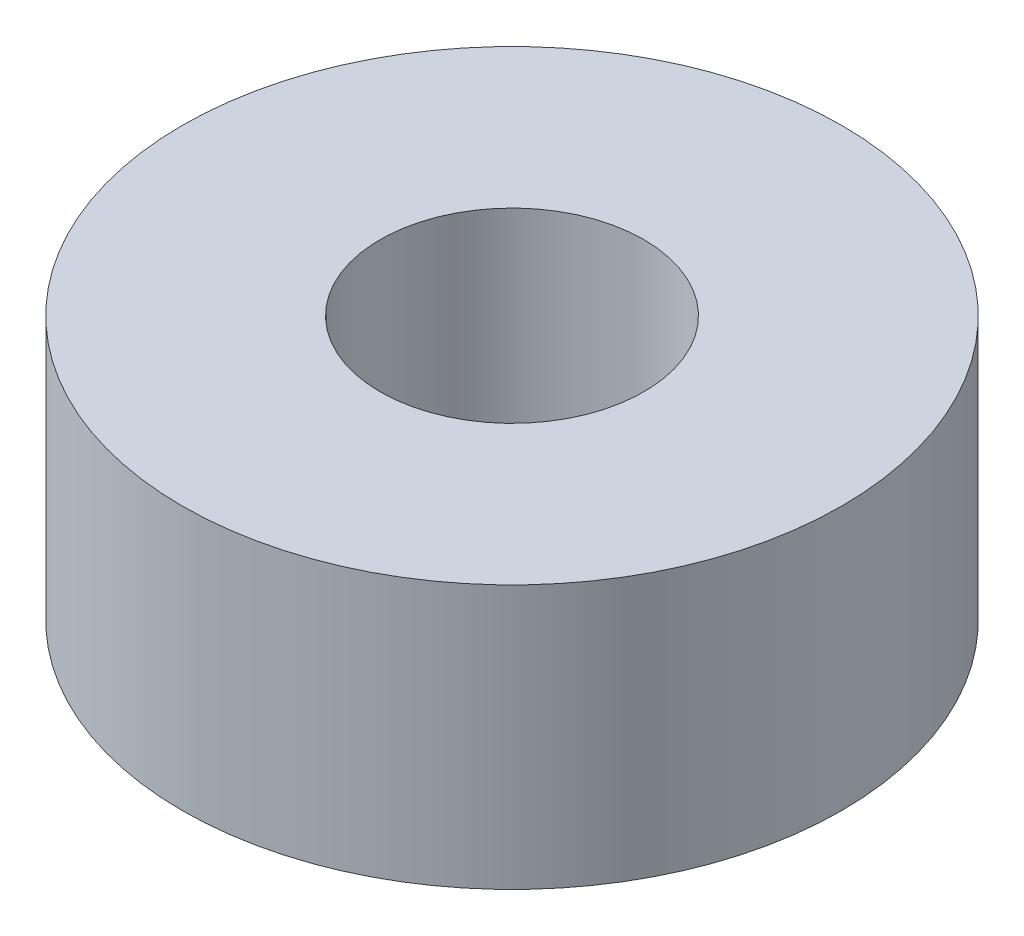
ISO-10303-21;
HEADER;
FILE_DESCRIPTION(('STEP AP214'),'2;1');
FILE_NAME('part.step','',(''),(''),'','','');
FILE_SCHEMA(('AUTOMOTIVE_DESIGN { 1 0 10303 214 1 1 1 1 }'));
ENDSEC;
DATA;
#1=APPLICATION_CONTEXT('core data for automotive mechanical design processes');
#2=APPLICATION_PROTOCOL_DEFINITION('international standard','automotive_design',2000,#1);
#3=PRODUCT_CONTEXT('',#1,'mechanical');
#4=PRODUCT('Part','Part','',(#3));
#5=PRODUCT_RELATED_PRODUCT_CATEGORY('part','',(#4));
#6=PRODUCT_DEFINITION_FORMATION('','',#4);
#7=PRODUCT_DEFINITION_CONTEXT('part definition',#1,'design');
#8=PRODUCT_DEFINITION('design','',#6,#7);
#9=PRODUCT_DEFINITION_SHAPE('','',#8);
#10=(LENGTH_UNIT() NAMED_UNIT(*) SI_UNIT(.MILLI.,.METRE.));
#11=(NAMED_UNIT(*) PLANE_ANGLE_UNIT() SI_UNIT($,.RADIAN.));
#12=(NAMED_UNIT(*) SI_UNIT($,.STERADIAN.) SOLID_ANGLE_UNIT());
#13=UNCERTAINTY_MEASURE_WITH_UNIT(LENGTH_MEASURE(1.E-05),#10,'distance_accuracy_value','');
#14=(GEOMETRIC_REPRESENTATION_CONTEXT(3) GLOBAL_UNCERTAINTY_ASSIGNED_CONTEXT((#13)) GLOBAL_UNIT_ASSIGNED_CONTEXT((#10,
#11,#12)) REPRESENTATION_CONTEXT('',''));
#15=CARTESIAN_POINT('',(0.,0.,0.));
#16=DIRECTION('',(0.,0.,1.));
#17=DIRECTION('',(1.,0.,0.));
#18=AXIS2_PLACEMENT_3D('',#15,#16,#17);
#19=CARTESIAN_POINT('',(0.,2.,0.));
#20=DIRECTION('',(0.,1.,0.));
#21=DIRECTION('',(0.,0.,1.));
#22=AXIS2_PLACEMENT_3D('',#19,#20,#21);
#23=PLANE('',#22);
#24=CARTESIAN_POINT('',(0.,2.,0.));
#25=DIRECTION('',(0.,1.,0.));
#26=DIRECTION('',(0.,0.,1.));
#27=AXIS2_PLACEMENT_3D('',#24,#25,#26);
#28=CIRCLE('',#27,2.5);
#29=CARTESIAN_POINT('',(0.,2.,2.5));
#30=VERTEX_POINT('',#29);
#31=EDGE_CURVE('E10',#30,#30,#28,.T.);
#32=ORIENTED_EDGE('',*,*,#31,.T.);
#33=EDGE_LOOP('',(#32));
#34=FACE_BOUND('',#33,.T.);
#35=CARTESIAN_POINT('',(0.,2.,0.));
#36=DIRECTION('',(0.,1.,0.));
#37=DIRECTION('',(0.,0.,1.));
#38=AXIS2_PLACEMENT_3D('',#35,#36,#37);
#39=CIRCLE('',#38,1.);
#40=CARTESIAN_POINT('',(0.,2.,1.));
#41=VERTEX_POINT('',#40);
#42=EDGE_CURVE('E50',#41,#41,#39,.T.);
#43=ORIENTED_EDGE('',*,*,#42,.F.);
#44=EDGE_LOOP('',(#43));
#45=FACE_BOUND('',#44,.T.);
#46=ADVANCED_FACE('F37',(#34,#45),#23,.T.);
#47=CARTESIAN_POINT('',(0.,0.,0.));
#48=DIRECTION('',(0.,1.,0.));
#49=DIRECTION('',(0.,0.,1.));
#50=AXIS2_PLACEMENT_3D('',#47,#48,#49);
#51=PLANE('',#50);
#52=CARTESIAN_POINT('',(0.,0.,0.));
#53=DIRECTION('',(0.,1.,0.));
#54=DIRECTION('',(0.,0.,1.));
#55=AXIS2_PLACEMENT_3D('',#52,#53,#54);
#56=CIRCLE('',#55,2.5);
#57=CARTESIAN_POINT('',(0.,0.,2.5));
#58=VERTEX_POINT('',#57);
#59=EDGE_CURVE('E41',#58,#58,#56,.T.);
#60=ORIENTED_EDGE('',*,*,#59,.F.);
#61=EDGE_LOOP('',(#60));
#62=FACE_BOUND('',#61,.T.);
#63=CARTESIAN_POINT('',(0.,0.,0.));
#64=DIRECTION('',(0.,1.,0.));
#65=DIRECTION('',(0.,0.,1.));
#66=AXIS2_PLACEMENT_3D('',#63,#64,#65);
#67=CIRCLE('',#66,1.);
#68=CARTESIAN_POINT('',(0.,0.,1.));
#69=VERTEX_POINT('',#68);
#70=EDGE_CURVE('E52',#69,#69,#67,.T.);
#71=ORIENTED_EDGE('',*,*,#70,.T.);
#72=EDGE_LOOP('',(#71));
#73=FACE_BOUND('',#72,.T.);
#74=ADVANCED_FACE('F64',(#62,#73),#51,.F.);
#75=CARTESIAN_POINT('',(0.,2.,0.));
#76=DIRECTION('',(0.,-1.,0.));
#77=DIRECTION('',(0.,0.,-1.));
#78=AXIS2_PLACEMENT_3D('',#75,#76,#77);
#79=CYLINDRICAL_SURFACE('',#78,2.5);
#80=ORIENTED_EDGE('',*,*,#31,.F.);
#81=EDGE_LOOP('',(#80));
#82=FACE_BOUND('',#81,.T.);
#83=ORIENTED_EDGE('',*,*,#59,.T.);
#84=EDGE_LOOP('',(#83));
#85=FACE_BOUND('',#84,.T.);
#86=ADVANCED_FACE('F39',(#82,#85),#79,.T.);
#87=CARTESIAN_POINT('',(0.,2.,0.));
#88=DIRECTION('',(0.,-1.,0.));
#89=DIRECTION('',(0.,0.,-1.));
#90=AXIS2_PLACEMENT_3D('',#87,#88,#89);
#91=CYLINDRICAL_SURFACE('',#90,1.);
#92=ORIENTED_EDGE('',*,*,#42,.T.);
#93=EDGE_LOOP('',(#92));
#94=FACE_BOUND('',#93,.T.);
#95=ORIENTED_EDGE('',*,*,#70,.F.);
#96=EDGE_LOOP('',(#95));
#97=FACE_BOUND('',#96,.T.);
#98=ADVANCED_FACE('F60',(#94,#97),#91,.F.);
#99=CLOSED_SHELL('',(#46,#74,#86,#98));
#100=MANIFOLD_SOLID_BREP('B2',#99);
#101=ADVANCED_BREP_SHAPE_REPRESENTATION('',(#18,#100),#14);
#102=SHAPE_DEFINITION_REPRESENTATION(#9,#101);
ENDSEC;
END-ISO-10303-21;
